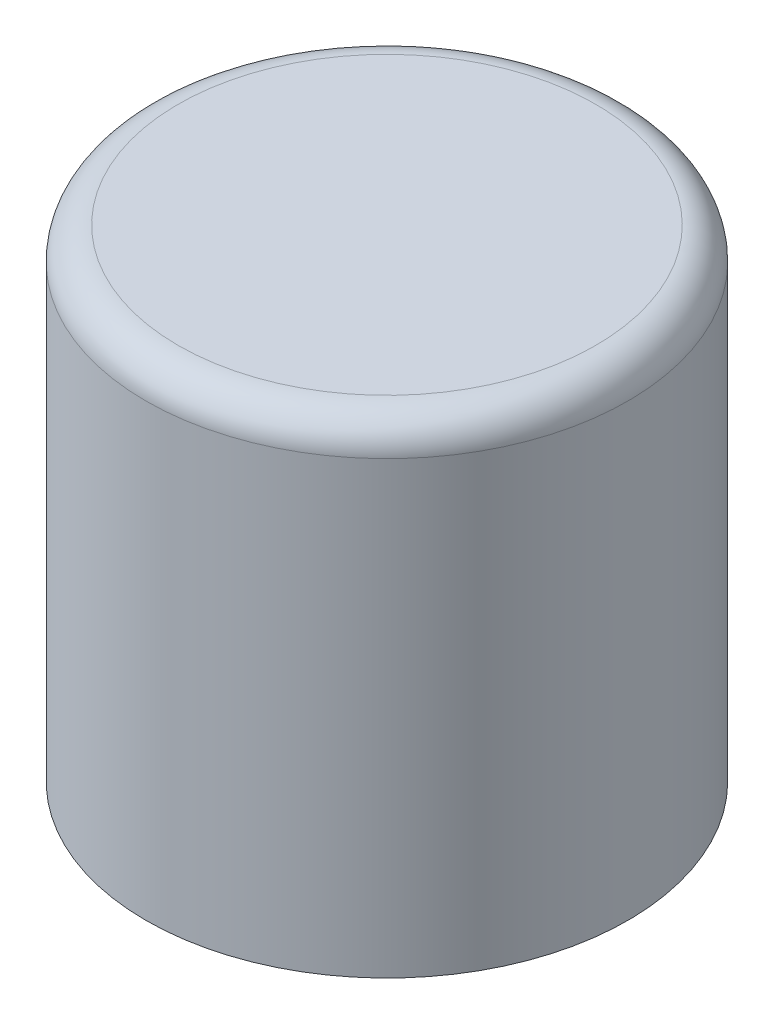
ISO-10303-21;
HEADER;
FILE_DESCRIPTION(('STEP AP214'),'2;1');
FILE_NAME('part.step','',(''),(''),'','','');
FILE_SCHEMA(('AUTOMOTIVE_DESIGN { 1 0 10303 214 1 1 1 1 }'));
ENDSEC;
DATA;
#1=APPLICATION_CONTEXT('core data for automotive mechanical design processes');
#2=APPLICATION_PROTOCOL_DEFINITION('international standard','automotive_design',2000,#1);
#3=PRODUCT_CONTEXT('',#1,'mechanical');
#4=PRODUCT('Part','Part','',(#3));
#5=PRODUCT_RELATED_PRODUCT_CATEGORY('part','',(#4));
#6=PRODUCT_DEFINITION_FORMATION('','',#4);
#7=PRODUCT_DEFINITION_CONTEXT('part definition',#1,'design');
#8=PRODUCT_DEFINITION('design','',#6,#7);
#9=PRODUCT_DEFINITION_SHAPE('','',#8);
#10=(LENGTH_UNIT() NAMED_UNIT(*) SI_UNIT(.MILLI.,.METRE.));
#11=(NAMED_UNIT(*) PLANE_ANGLE_UNIT() SI_UNIT($,.RADIAN.));
#12=(NAMED_UNIT(*) SI_UNIT($,.STERADIAN.) SOLID_ANGLE_UNIT());
#13=UNCERTAINTY_MEASURE_WITH_UNIT(LENGTH_MEASURE(1.E-05),#10,'distance_accuracy_value','');
#14=(GEOMETRIC_REPRESENTATION_CONTEXT(3) GLOBAL_UNCERTAINTY_ASSIGNED_CONTEXT((#13)) GLOBAL_UNIT_ASSIGNED_CONTEXT((#10,
#11,#12)) REPRESENTATION_CONTEXT('',''));
#15=CARTESIAN_POINT('',(0.,0.,0.));
#16=DIRECTION('',(0.,0.,1.));
#17=DIRECTION('',(1.,0.,0.));
#18=AXIS2_PLACEMENT_3D('',#15,#16,#17);
#19=CARTESIAN_POINT('',(0.,5.,0.));
#20=DIRECTION('',(0.,-1.,0.));
#21=DIRECTION('',(0.,0.,-1.));
#22=AXIS2_PLACEMENT_3D('',#19,#20,#21);
#23=CYLINDRICAL_SURFACE('',#22,15.);
#24=CARTESIAN_POINT('',(0.,3.,0.));
#25=DIRECTION('',(0.,1.,0.));
#26=DIRECTION('',(0.,0.,1.));
#27=AXIS2_PLACEMENT_3D('',#24,#25,#26);
#28=CIRCLE('',#27,15.);
#29=CARTESIAN_POINT('',(0.,3.,15.));
#30=VERTEX_POINT('',#29);
#31=EDGE_CURVE('E10',#30,#30,#28,.F.);
#32=ORIENTED_EDGE('',*,*,#31,.T.);
#33=EDGE_LOOP('',(#32));
#34=FACE_BOUND('',#33,.T.);
#35=CARTESIAN_POINT('',(0.,-25.,0.));
#36=DIRECTION('',(0.,1.,0.));
#37=DIRECTION('',(0.,0.,1.));
#38=AXIS2_PLACEMENT_3D('',#35,#36,#37);
#39=CIRCLE('',#38,15.);
#40=CARTESIAN_POINT('',(0.,-25.,15.));
#41=VERTEX_POINT('',#40);
#42=EDGE_CURVE('E59',#41,#41,#39,.T.);
#43=ORIENTED_EDGE('',*,*,#42,.T.);
#44=EDGE_LOOP('',(#43));
#45=FACE_BOUND('',#44,.T.);
#46=ADVANCED_FACE('F41',(#34,#45),#23,.T.);
#47=CARTESIAN_POINT('',(0.,5.,0.));
#48=DIRECTION('',(0.,1.,0.));
#49=DIRECTION('',(0.,0.,1.));
#50=AXIS2_PLACEMENT_3D('',#47,#48,#49);
#51=PLANE('',#50);
#52=CARTESIAN_POINT('',(0.,5.,0.));
#53=DIRECTION('',(0.,1.,0.));
#54=DIRECTION('',(0.,0.,1.));
#55=AXIS2_PLACEMENT_3D('',#52,#53,#54);
#56=CIRCLE('',#55,13.);
#57=CARTESIAN_POINT('',(0.,5.,13.));
#58=VERTEX_POINT('',#57);
#59=EDGE_CURVE('E49',#58,#58,#56,.T.);
#60=ORIENTED_EDGE('',*,*,#59,.T.);
#61=EDGE_LOOP('',(#60));
#62=FACE_BOUND('',#61,.T.);
#63=ADVANCED_FACE('F88',(#62),#51,.T.);
#64=CARTESIAN_POINT('',(0.,-25.,0.));
#65=DIRECTION('',(0.,1.,0.));
#66=DIRECTION('',(0.,0.,1.));
#67=AXIS2_PLACEMENT_3D('',#64,#65,#66);
#68=PLANE('',#67);
#69=CARTESIAN_POINT('',(0.,-25.,0.));
#70=DIRECTION('',(0.,1.,0.));
#71=DIRECTION('',(0.,0.,1.));
#72=AXIS2_PLACEMENT_3D('',#69,#70,#71);
#73=CIRCLE('',#72,10.);
#74=CARTESIAN_POINT('',(0.,-25.,10.));
#75=VERTEX_POINT('',#74);
#76=EDGE_CURVE('E65',#75,#75,#73,.T.);
#77=ORIENTED_EDGE('',*,*,#76,.T.);
#78=EDGE_LOOP('',(#77));
#79=FACE_BOUND('',#78,.T.);
#80=ORIENTED_EDGE('',*,*,#42,.F.);
#81=EDGE_LOOP('',(#80));
#82=FACE_BOUND('',#81,.T.);
#83=ADVANCED_FACE('F70',(#79,#82),#68,.F.);
#84=CARTESIAN_POINT('',(0.,-25.,0.));
#85=DIRECTION('',(0.,1.,0.));
#86=DIRECTION('',(0.,0.,1.));
#87=AXIS2_PLACEMENT_3D('',#84,#85,#86);
#88=CYLINDRICAL_SURFACE('',#87,10.);
#89=ORIENTED_EDGE('',*,*,#76,.F.);
#90=EDGE_LOOP('',(#89));
#91=FACE_BOUND('',#90,.T.);
#92=CARTESIAN_POINT('',(0.,0.,0.));
#93=DIRECTION('',(0.,1.,0.));
#94=DIRECTION('',(0.,0.,1.));
#95=AXIS2_PLACEMENT_3D('',#92,#93,#94);
#96=CIRCLE('',#95,10.);
#97=CARTESIAN_POINT('',(0.,0.,10.));
#98=VERTEX_POINT('',#97);
#99=EDGE_CURVE('E54',#98,#98,#96,.T.);
#100=ORIENTED_EDGE('',*,*,#99,.T.);
#101=EDGE_LOOP('',(#100));
#102=FACE_BOUND('',#101,.T.);
#103=ADVANCED_FACE('F73',(#91,#102),#88,.F.);
#104=CARTESIAN_POINT('',(0.,0.,0.));
#105=DIRECTION('',(0.,1.,0.));
#106=DIRECTION('',(0.,0.,1.));
#107=AXIS2_PLACEMENT_3D('',#104,#105,#106);
#108=PLANE('',#107);
#109=ORIENTED_EDGE('',*,*,#99,.F.);
#110=EDGE_LOOP('',(#109));
#111=FACE_BOUND('',#110,.T.);
#112=ADVANCED_FACE('F76',(#111),#108,.F.);
#113=CARTESIAN_POINT('',(0.,3.,0.));
#114=DIRECTION('',(0.,1.,0.));
#115=DIRECTION('',(0.,0.,1.));
#116=AXIS2_PLACEMENT_3D('',#113,#114,#115);
#117=TOROIDAL_SURFACE('',#116,13.,2.);
#118=ORIENTED_EDGE('',*,*,#31,.F.);
#119=EDGE_LOOP('',(#118));
#120=FACE_BOUND('',#119,.T.);
#121=ORIENTED_EDGE('',*,*,#59,.F.);
#122=EDGE_LOOP('',(#121));
#123=FACE_BOUND('',#122,.T.);
#124=ADVANCED_FACE('F43',(#120,#123),#117,.T.);
#125=CLOSED_SHELL('',(#46,#63,#83,#103,#112,#124));
#126=MANIFOLD_SOLID_BREP('B2',#125);
#127=ADVANCED_BREP_SHAPE_REPRESENTATION('',(#18,#126),#14);
#128=SHAPE_DEFINITION_REPRESENTATION(#9,#127);
ENDSEC;
END-ISO-10303-21;
